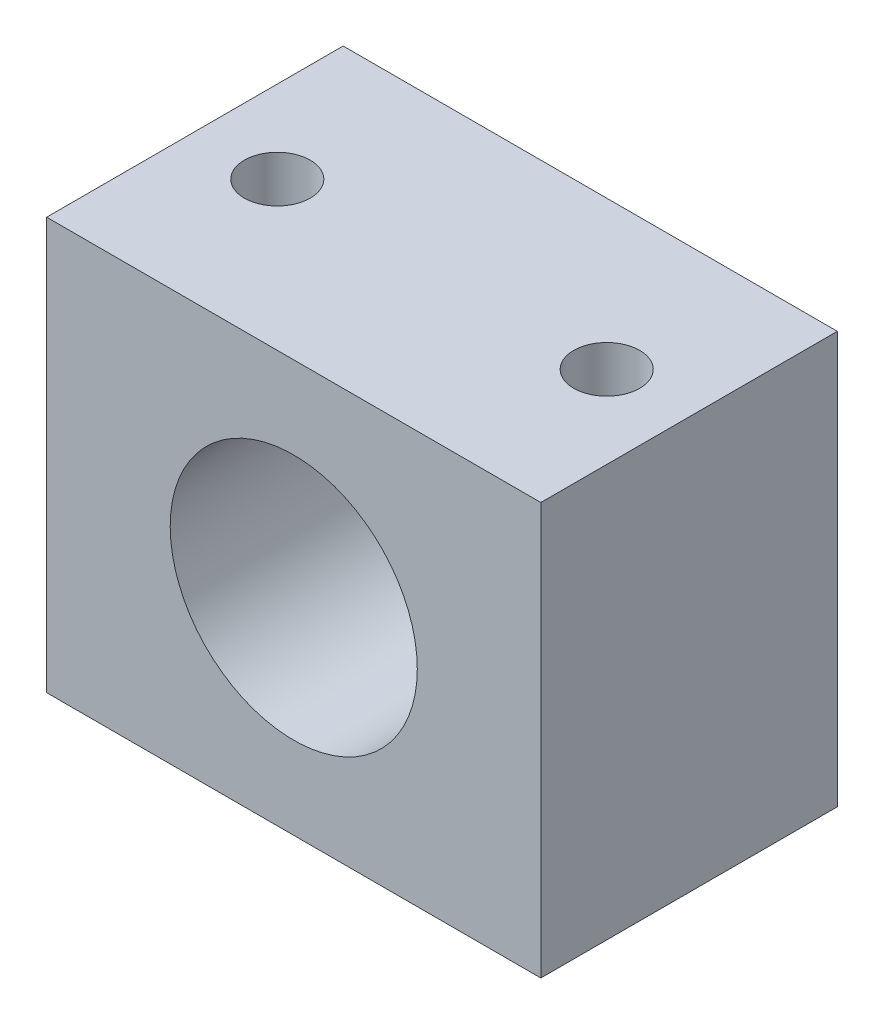
ISO-10303-21;
HEADER;
FILE_DESCRIPTION(('STEP AP214'),'2;1');
FILE_NAME('part.step','',(''),(''),'','','');
FILE_SCHEMA(('AUTOMOTIVE_DESIGN { 1 0 10303 214 1 1 1 1 }'));
ENDSEC;
DATA;
#1=APPLICATION_CONTEXT('core data for automotive mechanical design processes');
#2=APPLICATION_PROTOCOL_DEFINITION('international standard','automotive_design',2000,#1);
#3=PRODUCT_CONTEXT('',#1,'mechanical');
#4=PRODUCT('Part','Part','',(#3));
#5=PRODUCT_RELATED_PRODUCT_CATEGORY('part','',(#4));
#6=PRODUCT_DEFINITION_FORMATION('','',#4);
#7=PRODUCT_DEFINITION_CONTEXT('part definition',#1,'design');
#8=PRODUCT_DEFINITION('design','',#6,#7);
#9=PRODUCT_DEFINITION_SHAPE('','',#8);
#10=(LENGTH_UNIT() NAMED_UNIT(*) SI_UNIT(.MILLI.,.METRE.));
#11=(NAMED_UNIT(*) PLANE_ANGLE_UNIT() SI_UNIT($,.RADIAN.));
#12=(NAMED_UNIT(*) SI_UNIT($,.STERADIAN.) SOLID_ANGLE_UNIT());
#13=UNCERTAINTY_MEASURE_WITH_UNIT(LENGTH_MEASURE(1.E-05),#10,'distance_accuracy_value','');
#14=(GEOMETRIC_REPRESENTATION_CONTEXT(3) GLOBAL_UNCERTAINTY_ASSIGNED_CONTEXT((#13)) GLOBAL_UNIT_ASSIGNED_CONTEXT((#10,
#11,#12)) REPRESENTATION_CONTEXT('',''));
#15=CARTESIAN_POINT('',(0.,0.,0.));
#16=DIRECTION('',(0.,0.,1.));
#17=DIRECTION('',(1.,0.,0.));
#18=AXIS2_PLACEMENT_3D('',#15,#16,#17);
#19=CARTESIAN_POINT('',(0.,0.,18.));
#20=DIRECTION('',(0.,0.,1.));
#21=DIRECTION('',(1.,0.,0.));
#22=AXIS2_PLACEMENT_3D('',#19,#20,#21);
#23=PLANE('',#22);
#24=DIRECTION('',(0.,1.,0.));
#25=VECTOR('',#24,1.);
#26=CARTESIAN_POINT('',(15.,12.5,18.));
#27=LINE('',#26,#25);
#28=CARTESIAN_POINT('',(15.,-12.5,18.));
#29=VERTEX_POINT('',#28);
#30=CARTESIAN_POINT('',(15.,12.5,18.));
#31=VERTEX_POINT('',#30);
#32=EDGE_CURVE('E85',#29,#31,#27,.T.);
#33=ORIENTED_EDGE('',*,*,#32,.T.);
#34=DIRECTION('',(-1.,0.,0.));
#35=VECTOR('',#34,1.);
#36=CARTESIAN_POINT('',(-15.,12.5,18.));
#37=LINE('',#36,#35);
#38=CARTESIAN_POINT('',(-15.,12.5,18.));
#39=VERTEX_POINT('',#38);
#40=EDGE_CURVE('E80',#31,#39,#37,.T.);
#41=ORIENTED_EDGE('',*,*,#40,.T.);
#42=DIRECTION('',(0.,-1.,0.));
#43=VECTOR('',#42,1.);
#44=CARTESIAN_POINT('',(-15.,12.5,18.));
#45=LINE('',#44,#43);
#46=CARTESIAN_POINT('',(-15.,-12.5,18.));
#47=VERTEX_POINT('',#46);
#48=EDGE_CURVE('E83',#39,#47,#45,.T.);
#49=ORIENTED_EDGE('',*,*,#48,.T.);
#50=DIRECTION('',(1.,0.,0.));
#51=VECTOR('',#50,1.);
#52=CARTESIAN_POINT('',(-15.,-12.5,18.));
#53=LINE('',#52,#51);
#54=EDGE_CURVE('E50',#47,#29,#53,.T.);
#55=ORIENTED_EDGE('',*,*,#54,.T.);
#56=EDGE_LOOP('',(#33,#41,#49,#55));
#57=FACE_BOUND('',#56,.T.);
#58=CARTESIAN_POINT('',(0.,0.,18.));
#59=DIRECTION('',(0.,0.,1.));
#60=DIRECTION('',(1.,0.,0.));
#61=AXIS2_PLACEMENT_3D('',#58,#59,#60);
#62=CIRCLE('',#61,7.5);
#63=CARTESIAN_POINT('',(7.5,0.,18.));
#64=VERTEX_POINT('',#63);
#65=EDGE_CURVE('E100',#64,#64,#62,.T.);
#66=ORIENTED_EDGE('',*,*,#65,.F.);
#67=EDGE_LOOP('',(#66));
#68=FACE_BOUND('',#67,.T.);
#69=ADVANCED_FACE('F33',(#57,#68),#23,.T.);
#70=CARTESIAN_POINT('',(0.,0.,0.));
#71=DIRECTION('',(0.,0.,1.));
#72=DIRECTION('',(1.,0.,0.));
#73=AXIS2_PLACEMENT_3D('',#70,#71,#72);
#74=PLANE('',#73);
#75=DIRECTION('',(0.,1.,0.));
#76=VECTOR('',#75,1.);
#77=CARTESIAN_POINT('',(15.,12.5,0.));
#78=LINE('',#77,#76);
#79=CARTESIAN_POINT('',(15.,-12.5,0.));
#80=VERTEX_POINT('',#79);
#81=CARTESIAN_POINT('',(15.,12.5,0.));
#82=VERTEX_POINT('',#81);
#83=EDGE_CURVE('E97',#80,#82,#78,.T.);
#84=ORIENTED_EDGE('',*,*,#83,.F.);
#85=DIRECTION('',(1.,0.,0.));
#86=VECTOR('',#85,1.);
#87=CARTESIAN_POINT('',(-15.,-12.5,0.));
#88=LINE('',#87,#86);
#89=CARTESIAN_POINT('',(-15.,-12.5,0.));
#90=VERTEX_POINT('',#89);
#91=EDGE_CURVE('E73',#90,#80,#88,.T.);
#92=ORIENTED_EDGE('',*,*,#91,.F.);
#93=DIRECTION('',(0.,-1.,0.));
#94=VECTOR('',#93,1.);
#95=CARTESIAN_POINT('',(-15.,12.5,0.));
#96=LINE('',#95,#94);
#97=CARTESIAN_POINT('',(-15.,12.5,0.));
#98=VERTEX_POINT('',#97);
#99=EDGE_CURVE('E67',#98,#90,#96,.T.);
#100=ORIENTED_EDGE('',*,*,#99,.F.);
#101=DIRECTION('',(-1.,0.,0.));
#102=VECTOR('',#101,1.);
#103=CARTESIAN_POINT('',(-15.,12.5,0.));
#104=LINE('',#103,#102);
#105=EDGE_CURVE('E89',#82,#98,#104,.T.);
#106=ORIENTED_EDGE('',*,*,#105,.F.);
#107=EDGE_LOOP('',(#84,#92,#100,#106));
#108=FACE_BOUND('',#107,.T.);
#109=CARTESIAN_POINT('',(0.,0.,0.));
#110=DIRECTION('',(0.,0.,1.));
#111=DIRECTION('',(1.,0.,0.));
#112=AXIS2_PLACEMENT_3D('',#109,#110,#111);
#113=CIRCLE('',#112,7.5);
#114=CARTESIAN_POINT('',(7.5,0.,0.));
#115=VERTEX_POINT('',#114);
#116=EDGE_CURVE('E112',#115,#115,#113,.T.);
#117=ORIENTED_EDGE('',*,*,#116,.T.);
#118=EDGE_LOOP('',(#117));
#119=FACE_BOUND('',#118,.T.);
#120=ADVANCED_FACE('F108',(#108,#119),#74,.F.);
#121=CARTESIAN_POINT('',(15.,12.5,18.));
#122=DIRECTION('',(-1.,0.,0.));
#123=DIRECTION('',(0.,-1.,0.));
#124=AXIS2_PLACEMENT_3D('',#121,#122,#123);
#125=PLANE('',#124);
#126=ORIENTED_EDGE('',*,*,#83,.T.);
#127=DIRECTION('',(0.,0.,-1.));
#128=VECTOR('',#127,1.);
#129=CARTESIAN_POINT('',(15.,12.5,18.));
#130=LINE('',#129,#128);
#131=EDGE_CURVE('E11',#31,#82,#130,.T.);
#132=ORIENTED_EDGE('',*,*,#131,.F.);
#133=ORIENTED_EDGE('',*,*,#32,.F.);
#134=DIRECTION('',(0.,0.,-1.));
#135=VECTOR('',#134,1.);
#136=CARTESIAN_POINT('',(15.,-12.5,18.));
#137=LINE('',#136,#135);
#138=EDGE_CURVE('E93',#29,#80,#137,.T.);
#139=ORIENTED_EDGE('',*,*,#138,.T.);
#140=EDGE_LOOP('',(#126,#132,#133,#139));
#141=FACE_BOUND('',#140,.T.);
#142=ADVANCED_FACE('F35',(#141),#125,.F.);
#143=CARTESIAN_POINT('',(-15.,12.5,18.));
#144=DIRECTION('',(0.,-1.,0.));
#145=DIRECTION('',(0.,0.,-1.));
#146=AXIS2_PLACEMENT_3D('',#143,#144,#145);
#147=PLANE('',#146);
#148=CARTESIAN_POINT('',(-10.,12.5,9.));
#149=DIRECTION('',(0.,1.,0.));
#150=DIRECTION('',(0.,0.,1.));
#151=AXIS2_PLACEMENT_3D('',#148,#149,#150);
#152=CIRCLE('',#151,2.);
#153=CARTESIAN_POINT('',(-10.,12.5,11.));
#154=VERTEX_POINT('',#153);
#155=EDGE_CURVE('E124',#154,#154,#152,.T.);
#156=ORIENTED_EDGE('',*,*,#155,.F.);
#157=EDGE_LOOP('',(#156));
#158=FACE_BOUND('',#157,.T.);
#159=CARTESIAN_POINT('',(10.,12.5,9.));
#160=DIRECTION('',(0.,1.,0.));
#161=DIRECTION('',(0.,0.,-1.));
#162=AXIS2_PLACEMENT_3D('',#159,#160,#161);
#163=CIRCLE('',#162,2.);
#164=CARTESIAN_POINT('',(10.,12.5,7.));
#165=VERTEX_POINT('',#164);
#166=EDGE_CURVE('E118',#165,#165,#163,.T.);
#167=ORIENTED_EDGE('',*,*,#166,.F.);
#168=EDGE_LOOP('',(#167));
#169=FACE_BOUND('',#168,.T.);
#170=ORIENTED_EDGE('',*,*,#105,.T.);
#171=DIRECTION('',(0.,0.,-1.));
#172=VECTOR('',#171,1.);
#173=CARTESIAN_POINT('',(-15.,12.5,18.));
#174=LINE('',#173,#172);
#175=EDGE_CURVE('E42',#39,#98,#174,.T.);
#176=ORIENTED_EDGE('',*,*,#175,.F.);
#177=ORIENTED_EDGE('',*,*,#40,.F.);
#178=ORIENTED_EDGE('',*,*,#131,.T.);
#179=EDGE_LOOP('',(#170,#176,#177,#178));
#180=FACE_BOUND('',#179,.T.);
#181=ADVANCED_FACE('F88',(#158,#169,#180),#147,.F.);
#182=CARTESIAN_POINT('',(-15.,12.5,18.));
#183=DIRECTION('',(1.,0.,0.));
#184=DIRECTION('',(0.,1.,0.));
#185=AXIS2_PLACEMENT_3D('',#182,#183,#184);
#186=PLANE('',#185);
#187=ORIENTED_EDGE('',*,*,#99,.T.);
#188=DIRECTION('',(0.,0.,-1.));
#189=VECTOR('',#188,1.);
#190=CARTESIAN_POINT('',(-15.,-12.5,18.));
#191=LINE('',#190,#189);
#192=EDGE_CURVE('E90',#47,#90,#191,.T.);
#193=ORIENTED_EDGE('',*,*,#192,.F.);
#194=ORIENTED_EDGE('',*,*,#48,.F.);
#195=ORIENTED_EDGE('',*,*,#175,.T.);
#196=EDGE_LOOP('',(#187,#193,#194,#195));
#197=FACE_BOUND('',#196,.T.);
#198=ADVANCED_FACE('F91',(#197),#186,.F.);
#199=CARTESIAN_POINT('',(-15.,-12.5,18.));
#200=DIRECTION('',(0.,1.,0.));
#201=DIRECTION('',(0.,0.,1.));
#202=AXIS2_PLACEMENT_3D('',#199,#200,#201);
#203=PLANE('',#202);
#204=CARTESIAN_POINT('',(-10.,-12.5,9.));
#205=DIRECTION('',(0.,1.,0.));
#206=DIRECTION('',(0.,0.,1.));
#207=AXIS2_PLACEMENT_3D('',#204,#205,#206);
#208=CIRCLE('',#207,2.);
#209=CARTESIAN_POINT('',(-10.,-12.5,11.));
#210=VERTEX_POINT('',#209);
#211=EDGE_CURVE('E115',#210,#210,#208,.T.);
#212=ORIENTED_EDGE('',*,*,#211,.T.);
#213=EDGE_LOOP('',(#212));
#214=FACE_BOUND('',#213,.T.);
#215=CARTESIAN_POINT('',(10.,-12.5,9.));
#216=DIRECTION('',(0.,1.,0.));
#217=DIRECTION('',(0.,0.,-1.));
#218=AXIS2_PLACEMENT_3D('',#215,#216,#217);
#219=CIRCLE('',#218,2.);
#220=CARTESIAN_POINT('',(10.,-12.5,7.));
#221=VERTEX_POINT('',#220);
#222=EDGE_CURVE('E121',#221,#221,#219,.T.);
#223=ORIENTED_EDGE('',*,*,#222,.T.);
#224=EDGE_LOOP('',(#223));
#225=FACE_BOUND('',#224,.T.);
#226=ORIENTED_EDGE('',*,*,#91,.T.);
#227=ORIENTED_EDGE('',*,*,#138,.F.);
#228=ORIENTED_EDGE('',*,*,#54,.F.);
#229=ORIENTED_EDGE('',*,*,#192,.T.);
#230=EDGE_LOOP('',(#226,#227,#228,#229));
#231=FACE_BOUND('',#230,.T.);
#232=ADVANCED_FACE('F105',(#214,#225,#231),#203,.F.);
#233=CARTESIAN_POINT('',(0.,0.,18.));
#234=DIRECTION('',(0.,0.,-1.));
#235=DIRECTION('',(-1.,0.,0.));
#236=AXIS2_PLACEMENT_3D('',#233,#234,#235);
#237=CYLINDRICAL_SURFACE('',#236,7.5);
#238=ORIENTED_EDGE('',*,*,#65,.T.);
#239=EDGE_LOOP('',(#238));
#240=FACE_BOUND('',#239,.T.);
#241=ORIENTED_EDGE('',*,*,#116,.F.);
#242=EDGE_LOOP('',(#241));
#243=FACE_BOUND('',#242,.T.);
#244=ADVANCED_FACE('F144',(#240,#243),#237,.F.);
#245=CARTESIAN_POINT('',(10.,-12.5,9.));
#246=DIRECTION('',(0.,1.,0.));
#247=DIRECTION('',(0.,0.,1.));
#248=AXIS2_PLACEMENT_3D('',#245,#246,#247);
#249=CYLINDRICAL_SURFACE('',#248,2.);
#250=ORIENTED_EDGE('',*,*,#222,.F.);
#251=EDGE_LOOP('',(#250));
#252=FACE_BOUND('',#251,.T.);
#253=ORIENTED_EDGE('',*,*,#166,.T.);
#254=EDGE_LOOP('',(#253));
#255=FACE_BOUND('',#254,.T.);
#256=ADVANCED_FACE('F135',(#252,#255),#249,.F.);
#257=CARTESIAN_POINT('',(-10.,-12.5,9.));
#258=DIRECTION('',(0.,1.,0.));
#259=DIRECTION('',(0.,0.,1.));
#260=AXIS2_PLACEMENT_3D('',#257,#258,#259);
#261=CYLINDRICAL_SURFACE('',#260,2.);
#262=ORIENTED_EDGE('',*,*,#211,.F.);
#263=EDGE_LOOP('',(#262));
#264=FACE_BOUND('',#263,.T.);
#265=ORIENTED_EDGE('',*,*,#155,.T.);
#266=EDGE_LOOP('',(#265));
#267=FACE_BOUND('',#266,.T.);
#268=ADVANCED_FACE('F132',(#264,#267),#261,.F.);
#269=CLOSED_SHELL('',(#69,#120,#142,#181,#198,#232,#244,#256,#268));
#270=MANIFOLD_SOLID_BREP('B2',#269);
#271=ADVANCED_BREP_SHAPE_REPRESENTATION('',(#18,#270),#14);
#272=SHAPE_DEFINITION_REPRESENTATION(#9,#271);
ENDSEC;
END-ISO-10303-21;
